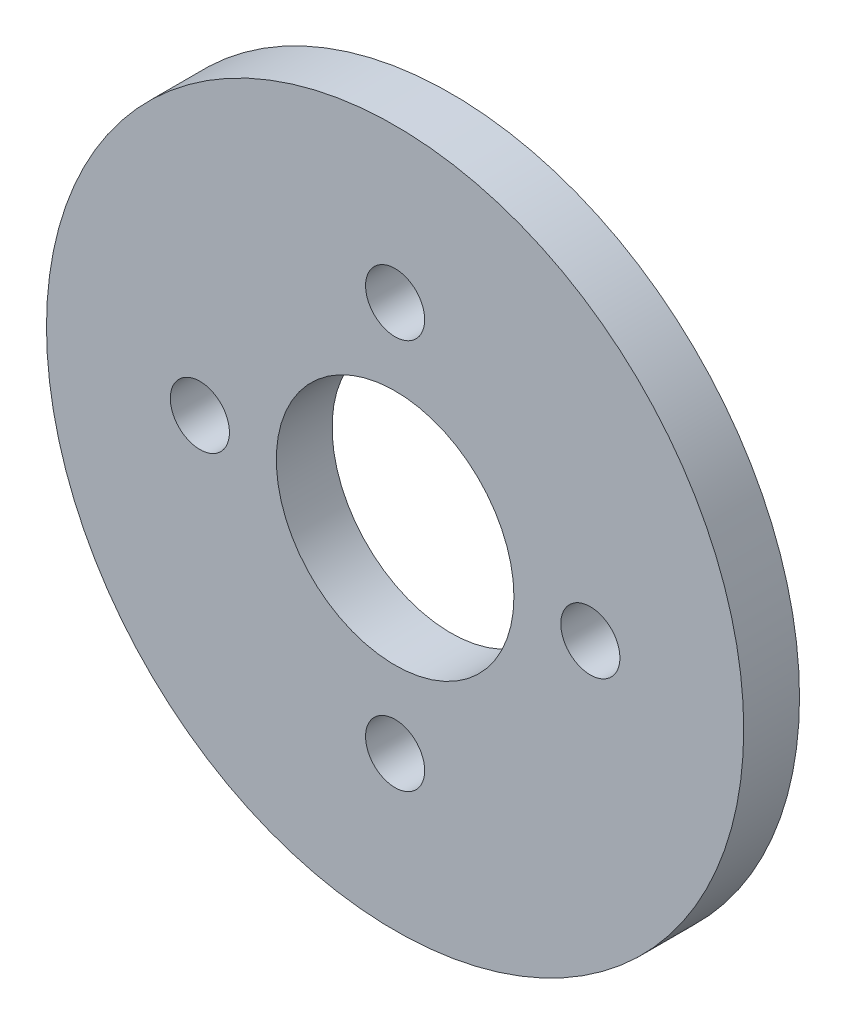
ISO-10303-21;
HEADER;
FILE_DESCRIPTION(('STEP AP214'),'2;1');
FILE_NAME('part.step','',(''),(''),'','','');
FILE_SCHEMA(('AUTOMOTIVE_DESIGN { 1 0 10303 214 1 1 1 1 }'));
ENDSEC;
DATA;
#1=APPLICATION_CONTEXT('core data for automotive mechanical design processes');
#2=APPLICATION_PROTOCOL_DEFINITION('international standard','automotive_design',2000,#1);
#3=PRODUCT_CONTEXT('',#1,'mechanical');
#4=PRODUCT('Part','Part','',(#3));
#5=PRODUCT_RELATED_PRODUCT_CATEGORY('part','',(#4));
#6=PRODUCT_DEFINITION_FORMATION('','',#4);
#7=PRODUCT_DEFINITION_CONTEXT('part definition',#1,'design');
#8=PRODUCT_DEFINITION('design','',#6,#7);
#9=PRODUCT_DEFINITION_SHAPE('','',#8);
#10=(LENGTH_UNIT() NAMED_UNIT(*) SI_UNIT(.MILLI.,.METRE.));
#11=(NAMED_UNIT(*) PLANE_ANGLE_UNIT() SI_UNIT($,.RADIAN.));
#12=(NAMED_UNIT(*) SI_UNIT($,.STERADIAN.) SOLID_ANGLE_UNIT());
#13=UNCERTAINTY_MEASURE_WITH_UNIT(LENGTH_MEASURE(1.E-05),#10,'distance_accuracy_value','');
#14=(GEOMETRIC_REPRESENTATION_CONTEXT(3) GLOBAL_UNCERTAINTY_ASSIGNED_CONTEXT((#13)) GLOBAL_UNIT_ASSIGNED_CONTEXT((#10,
#11,#12)) REPRESENTATION_CONTEXT('',''));
#15=CARTESIAN_POINT('',(0.,0.,0.));
#16=DIRECTION('',(0.,0.,1.));
#17=DIRECTION('',(1.,0.,0.));
#18=AXIS2_PLACEMENT_3D('',#15,#16,#17);
#19=CARTESIAN_POINT('',(0.,35.,10.));
#20=DIRECTION('',(0.,0.,-1.));
#21=DIRECTION('',(-1.,0.,0.));
#22=AXIS2_PLACEMENT_3D('',#19,#20,#21);
#23=CYLINDRICAL_SURFACE('',#22,5.3);
#24=CARTESIAN_POINT('',(0.,35.,10.));
#25=DIRECTION('',(0.,0.,1.));
#26=DIRECTION('',(1.,0.,0.));
#27=AXIS2_PLACEMENT_3D('',#24,#25,#26);
#28=CIRCLE('',#27,5.3);
#29=CARTESIAN_POINT('',(5.3,35.,10.));
#30=VERTEX_POINT('',#29);
#31=EDGE_CURVE('E44',#30,#30,#28,.T.);
#32=ORIENTED_EDGE('',*,*,#31,.T.);
#33=EDGE_LOOP('',(#32));
#34=FACE_BOUND('',#33,.T.);
#35=CARTESIAN_POINT('',(0.,35.,0.));
#36=DIRECTION('',(0.,0.,1.));
#37=DIRECTION('',(1.,0.,0.));
#38=AXIS2_PLACEMENT_3D('',#35,#36,#37);
#39=CIRCLE('',#38,5.3);
#40=CARTESIAN_POINT('',(5.3,35.,0.));
#41=VERTEX_POINT('',#40);
#42=EDGE_CURVE('E64',#41,#41,#39,.T.);
#43=ORIENTED_EDGE('',*,*,#42,.F.);
#44=EDGE_LOOP('',(#43));
#45=FACE_BOUND('',#44,.T.);
#46=ADVANCED_FACE('F36',(#34,#45),#23,.F.);
#47=CARTESIAN_POINT('',(35.,0.,10.));
#48=DIRECTION('',(0.,0.,-1.));
#49=DIRECTION('',(-1.,0.,0.));
#50=AXIS2_PLACEMENT_3D('',#47,#48,#49);
#51=CYLINDRICAL_SURFACE('',#50,5.3);
#52=CARTESIAN_POINT('',(35.,0.,10.));
#53=DIRECTION('',(0.,0.,1.));
#54=DIRECTION('',(1.,0.,0.));
#55=AXIS2_PLACEMENT_3D('',#52,#53,#54);
#56=CIRCLE('',#55,5.3);
#57=CARTESIAN_POINT('',(40.3,0.,10.));
#58=VERTEX_POINT('',#57);
#59=EDGE_CURVE('E49',#58,#58,#56,.T.);
#60=ORIENTED_EDGE('',*,*,#59,.T.);
#61=EDGE_LOOP('',(#60));
#62=FACE_BOUND('',#61,.T.);
#63=CARTESIAN_POINT('',(35.,0.,0.));
#64=DIRECTION('',(0.,0.,1.));
#65=DIRECTION('',(1.,0.,0.));
#66=AXIS2_PLACEMENT_3D('',#63,#64,#65);
#67=CIRCLE('',#66,5.3);
#68=CARTESIAN_POINT('',(40.3,0.,0.));
#69=VERTEX_POINT('',#68);
#70=EDGE_CURVE('E62',#69,#69,#67,.T.);
#71=ORIENTED_EDGE('',*,*,#70,.F.);
#72=EDGE_LOOP('',(#71));
#73=FACE_BOUND('',#72,.T.);
#74=ADVANCED_FACE('F85',(#62,#73),#51,.F.);
#75=CARTESIAN_POINT('',(0.,-35.,10.));
#76=DIRECTION('',(0.,0.,-1.));
#77=DIRECTION('',(-1.,0.,0.));
#78=AXIS2_PLACEMENT_3D('',#75,#76,#77);
#79=CYLINDRICAL_SURFACE('',#78,5.3);
#80=CARTESIAN_POINT('',(0.,-35.,10.));
#81=DIRECTION('',(0.,0.,1.));
#82=DIRECTION('',(1.,0.,0.));
#83=AXIS2_PLACEMENT_3D('',#80,#81,#82);
#84=CIRCLE('',#83,5.3);
#85=CARTESIAN_POINT('',(5.3,-35.,10.));
#86=VERTEX_POINT('',#85);
#87=EDGE_CURVE('E78',#86,#86,#84,.T.);
#88=ORIENTED_EDGE('',*,*,#87,.T.);
#89=EDGE_LOOP('',(#88));
#90=FACE_BOUND('',#89,.T.);
#91=CARTESIAN_POINT('',(0.,-35.,0.));
#92=DIRECTION('',(0.,0.,1.));
#93=DIRECTION('',(1.,0.,0.));
#94=AXIS2_PLACEMENT_3D('',#91,#92,#93);
#95=CIRCLE('',#94,5.3);
#96=CARTESIAN_POINT('',(5.3,-35.,0.));
#97=VERTEX_POINT('',#96);
#98=EDGE_CURVE('E59',#97,#97,#95,.T.);
#99=ORIENTED_EDGE('',*,*,#98,.F.);
#100=EDGE_LOOP('',(#99));
#101=FACE_BOUND('',#100,.T.);
#102=ADVANCED_FACE('F103',(#90,#101),#79,.F.);
#103=CARTESIAN_POINT('',(-35.,0.,10.));
#104=DIRECTION('',(0.,0.,-1.));
#105=DIRECTION('',(-1.,0.,0.));
#106=AXIS2_PLACEMENT_3D('',#103,#104,#105);
#107=CYLINDRICAL_SURFACE('',#106,5.3);
#108=CARTESIAN_POINT('',(-35.,0.,10.));
#109=DIRECTION('',(0.,0.,1.));
#110=DIRECTION('',(1.,0.,0.));
#111=AXIS2_PLACEMENT_3D('',#108,#109,#110);
#112=CIRCLE('',#111,5.3);
#113=CARTESIAN_POINT('',(-29.7,0.,10.));
#114=VERTEX_POINT('',#113);
#115=EDGE_CURVE('E73',#114,#114,#112,.T.);
#116=ORIENTED_EDGE('',*,*,#115,.T.);
#117=EDGE_LOOP('',(#116));
#118=FACE_BOUND('',#117,.T.);
#119=CARTESIAN_POINT('',(-35.,0.,0.));
#120=DIRECTION('',(0.,0.,1.));
#121=DIRECTION('',(1.,0.,0.));
#122=AXIS2_PLACEMENT_3D('',#119,#120,#121);
#123=CIRCLE('',#122,5.3);
#124=CARTESIAN_POINT('',(-29.7,0.,0.));
#125=VERTEX_POINT('',#124);
#126=EDGE_CURVE('E56',#125,#125,#123,.T.);
#127=ORIENTED_EDGE('',*,*,#126,.F.);
#128=EDGE_LOOP('',(#127));
#129=FACE_BOUND('',#128,.T.);
#130=ADVANCED_FACE('F109',(#118,#129),#107,.F.);
#131=CARTESIAN_POINT('',(0.,0.,10.));
#132=DIRECTION('',(0.,0.,-1.));
#133=DIRECTION('',(-1.,0.,0.));
#134=AXIS2_PLACEMENT_3D('',#131,#132,#133);
#135=CYLINDRICAL_SURFACE('',#134,21.3);
#136=CARTESIAN_POINT('',(0.,0.,10.));
#137=DIRECTION('',(0.,0.,1.));
#138=DIRECTION('',(1.,0.,0.));
#139=AXIS2_PLACEMENT_3D('',#136,#137,#138);
#140=CIRCLE('',#139,21.3);
#141=CARTESIAN_POINT('',(21.3,0.,10.));
#142=VERTEX_POINT('',#141);
#143=EDGE_CURVE('E69',#142,#142,#140,.T.);
#144=ORIENTED_EDGE('',*,*,#143,.T.);
#145=EDGE_LOOP('',(#144));
#146=FACE_BOUND('',#145,.T.);
#147=CARTESIAN_POINT('',(0.,0.,0.));
#148=DIRECTION('',(0.,0.,1.));
#149=DIRECTION('',(1.,0.,0.));
#150=AXIS2_PLACEMENT_3D('',#147,#148,#149);
#151=CIRCLE('',#150,21.3);
#152=CARTESIAN_POINT('',(21.3,0.,0.));
#153=VERTEX_POINT('',#152);
#154=EDGE_CURVE('E53',#153,#153,#151,.T.);
#155=ORIENTED_EDGE('',*,*,#154,.F.);
#156=EDGE_LOOP('',(#155));
#157=FACE_BOUND('',#156,.T.);
#158=ADVANCED_FACE('F38',(#146,#157),#135,.F.);
#159=CARTESIAN_POINT('',(0.,0.,10.));
#160=DIRECTION('',(0.,0.,-1.));
#161=DIRECTION('',(-1.,0.,0.));
#162=AXIS2_PLACEMENT_3D('',#159,#160,#161);
#163=CYLINDRICAL_SURFACE('',#162,62.5);
#164=CARTESIAN_POINT('',(0.,0.,10.));
#165=DIRECTION('',(0.,0.,1.));
#166=DIRECTION('',(1.,0.,0.));
#167=AXIS2_PLACEMENT_3D('',#164,#165,#166);
#168=CIRCLE('',#167,62.5);
#169=CARTESIAN_POINT('',(62.5,0.,10.));
#170=VERTEX_POINT('',#169);
#171=EDGE_CURVE('E10',#170,#170,#168,.T.);
#172=ORIENTED_EDGE('',*,*,#171,.F.);
#173=EDGE_LOOP('',(#172));
#174=FACE_BOUND('',#173,.T.);
#175=CARTESIAN_POINT('',(0.,0.,0.));
#176=DIRECTION('',(0.,0.,1.));
#177=DIRECTION('',(1.,0.,0.));
#178=AXIS2_PLACEMENT_3D('',#175,#176,#177);
#179=CIRCLE('',#178,62.5);
#180=CARTESIAN_POINT('',(62.5,0.,0.));
#181=VERTEX_POINT('',#180);
#182=EDGE_CURVE('E40',#181,#181,#179,.T.);
#183=ORIENTED_EDGE('',*,*,#182,.T.);
#184=EDGE_LOOP('',(#183));
#185=FACE_BOUND('',#184,.T.);
#186=ADVANCED_FACE('F92',(#174,#185),#163,.T.);
#187=CARTESIAN_POINT('',(0.,0.,10.));
#188=DIRECTION('',(0.,0.,1.));
#189=DIRECTION('',(1.,0.,0.));
#190=AXIS2_PLACEMENT_3D('',#187,#188,#189);
#191=PLANE('',#190);
#192=ORIENTED_EDGE('',*,*,#143,.F.);
#193=EDGE_LOOP('',(#192));
#194=FACE_BOUND('',#193,.T.);
#195=ORIENTED_EDGE('',*,*,#115,.F.);
#196=EDGE_LOOP('',(#195));
#197=FACE_BOUND('',#196,.T.);
#198=ORIENTED_EDGE('',*,*,#87,.F.);
#199=EDGE_LOOP('',(#198));
#200=FACE_BOUND('',#199,.T.);
#201=ORIENTED_EDGE('',*,*,#59,.F.);
#202=EDGE_LOOP('',(#201));
#203=FACE_BOUND('',#202,.T.);
#204=ORIENTED_EDGE('',*,*,#31,.F.);
#205=EDGE_LOOP('',(#204));
#206=FACE_BOUND('',#205,.T.);
#207=ORIENTED_EDGE('',*,*,#171,.T.);
#208=EDGE_LOOP('',(#207));
#209=FACE_BOUND('',#208,.T.);
#210=ADVANCED_FACE('F88',(#194,#197,#200,#203,#206,#209),#191,.T.);
#211=CARTESIAN_POINT('',(0.,0.,0.));
#212=DIRECTION('',(0.,0.,1.));
#213=DIRECTION('',(1.,0.,0.));
#214=AXIS2_PLACEMENT_3D('',#211,#212,#213);
#215=PLANE('',#214);
#216=ORIENTED_EDGE('',*,*,#154,.T.);
#217=EDGE_LOOP('',(#216));
#218=FACE_BOUND('',#217,.T.);
#219=ORIENTED_EDGE('',*,*,#126,.T.);
#220=EDGE_LOOP('',(#219));
#221=FACE_BOUND('',#220,.T.);
#222=ORIENTED_EDGE('',*,*,#98,.T.);
#223=EDGE_LOOP('',(#222));
#224=FACE_BOUND('',#223,.T.);
#225=ORIENTED_EDGE('',*,*,#70,.T.);
#226=EDGE_LOOP('',(#225));
#227=FACE_BOUND('',#226,.T.);
#228=ORIENTED_EDGE('',*,*,#42,.T.);
#229=EDGE_LOOP('',(#228));
#230=FACE_BOUND('',#229,.T.);
#231=ORIENTED_EDGE('',*,*,#182,.F.);
#232=EDGE_LOOP('',(#231));
#233=FACE_BOUND('',#232,.T.);
#234=ADVANCED_FACE('F91',(#218,#221,#224,#227,#230,#233),#215,.F.);
#235=CLOSED_SHELL('',(#46,#74,#102,#130,#158,#186,#210,#234));
#236=MANIFOLD_SOLID_BREP('B2',#235);
#237=ADVANCED_BREP_SHAPE_REPRESENTATION('',(#18,#236),#14);
#238=SHAPE_DEFINITION_REPRESENTATION(#9,#237);
ENDSEC;
END-ISO-10303-21;
